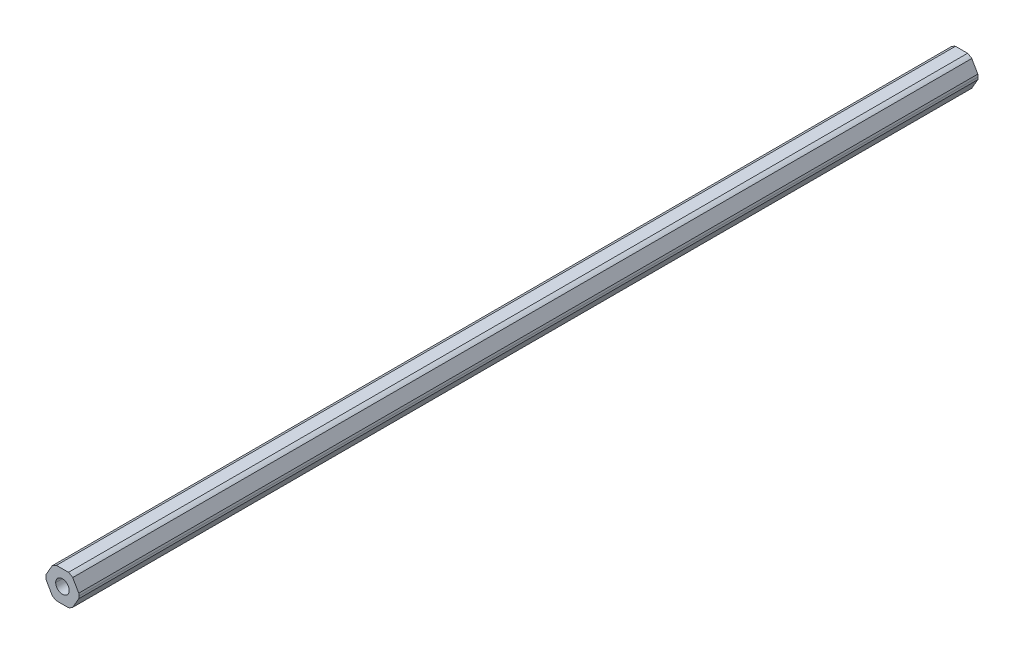
ISO-10303-21;
HEADER;
FILE_DESCRIPTION(('STEP AP214'),'2;1');
FILE_NAME('part.step','',(''),(''),'','','');
FILE_SCHEMA(('AUTOMOTIVE_DESIGN { 1 0 10303 214 1 1 1 1 }'));
ENDSEC;
DATA;
#1=APPLICATION_CONTEXT('core data for automotive mechanical design processes');
#2=APPLICATION_PROTOCOL_DEFINITION('international standard','automotive_design',2000,#1);
#3=PRODUCT_CONTEXT('',#1,'mechanical');
#4=PRODUCT('Part','Part','',(#3));
#5=PRODUCT_RELATED_PRODUCT_CATEGORY('part','',(#4));
#6=PRODUCT_DEFINITION_FORMATION('','',#4);
#7=PRODUCT_DEFINITION_CONTEXT('part definition',#1,'design');
#8=PRODUCT_DEFINITION('design','',#6,#7);
#9=PRODUCT_DEFINITION_SHAPE('','',#8);
#10=(LENGTH_UNIT() NAMED_UNIT(*) SI_UNIT(.MILLI.,.METRE.));
#11=(NAMED_UNIT(*) PLANE_ANGLE_UNIT() SI_UNIT($,.RADIAN.));
#12=(NAMED_UNIT(*) SI_UNIT($,.STERADIAN.) SOLID_ANGLE_UNIT());
#13=UNCERTAINTY_MEASURE_WITH_UNIT(LENGTH_MEASURE(1.E-05),#10,'distance_accuracy_value','');
#14=(GEOMETRIC_REPRESENTATION_CONTEXT(3) GLOBAL_UNCERTAINTY_ASSIGNED_CONTEXT((#13)) GLOBAL_UNIT_ASSIGNED_CONTEXT((#10,
#11,#12)) REPRESENTATION_CONTEXT('',''));
#15=CARTESIAN_POINT('',(0.,0.,0.));
#16=DIRECTION('',(0.,0.,1.));
#17=DIRECTION('',(1.,0.,0.));
#18=AXIS2_PLACEMENT_3D('',#15,#16,#17);
#19=CARTESIAN_POINT('',(-52.1346729987185,-22.9295542640871,-414.111242853386));
#20=DIRECTION('',(0.,0.,1.));
#21=DIRECTION('',(1.,0.,0.));
#22=AXIS2_PLACEMENT_3D('',#19,#20,#21);
#23=CYLINDRICAL_SURFACE('',#22,2.1);
#24=DIRECTION('',(0.,0.,1.));
#25=VECTOR('',#24,1.);
#26=CARTESIAN_POINT('',(-54.2346729987185,-22.9295542640871,-414.111242853386));
#27=LINE('',#26,#25);
#28=CARTESIAN_POINT('',(-54.2346729987185,-22.9295542640871,-414.111242853386));
#29=VERTEX_POINT('',#28);
#30=CARTESIAN_POINT('',(-54.2346729987185,-22.9295542640871,-134.711242853386));
#31=VERTEX_POINT('',#30);
#32=EDGE_CURVE('E52',#29,#31,#27,.T.);
#33=ORIENTED_EDGE('',*,*,#32,.T.);
#34=CARTESIAN_POINT('',(-52.1346729987185,-22.9295542640871,-134.711242853386));
#35=DIRECTION('',(0.,0.,-1.));
#36=DIRECTION('',(-1.,0.,0.));
#37=AXIS2_PLACEMENT_3D('',#34,#35,#36);
#38=CIRCLE('',#37,2.1);
#39=CARTESIAN_POINT('',(-50.0346729987185,-22.9295542640871,-134.711242853386));
#40=VERTEX_POINT('',#39);
#41=EDGE_CURVE('E66',#31,#40,#38,.F.);
#42=ORIENTED_EDGE('',*,*,#41,.T.);
#43=DIRECTION('',(0.,0.,1.));
#44=VECTOR('',#43,1.);
#45=CARTESIAN_POINT('',(-50.0346729987185,-22.9295542640871,-414.111242853386));
#46=LINE('',#45,#44);
#47=CARTESIAN_POINT('',(-50.0346729987185,-22.9295542640871,-414.111242853386));
#48=VERTEX_POINT('',#47);
#49=EDGE_CURVE('E168',#48,#40,#46,.T.);
#50=ORIENTED_EDGE('',*,*,#49,.F.);
#51=CARTESIAN_POINT('',(-52.1346729987185,-22.9295542640871,-414.111242853386));
#52=DIRECTION('',(0.,0.,1.));
#53=DIRECTION('',(1.,0.,0.));
#54=AXIS2_PLACEMENT_3D('',#51,#52,#53);
#55=CIRCLE('',#54,2.1);
#56=EDGE_CURVE('E209',#29,#48,#55,.T.);
#57=ORIENTED_EDGE('',*,*,#56,.F.);
#58=EDGE_LOOP('',(#33,#42,#50,#57));
#59=FACE_BOUND('',#58,.T.);
#60=ADVANCED_FACE('F44',(#59),#23,.F.);
#61=CARTESIAN_POINT('',(-52.1346729987185,-22.9295542640871,-414.111242853386));
#62=DIRECTION('',(0.,0.,1.));
#63=DIRECTION('',(1.,0.,0.));
#64=AXIS2_PLACEMENT_3D('',#61,#62,#63);
#65=CYLINDRICAL_SURFACE('',#64,5.12);
#66=CARTESIAN_POINT('',(-52.1346729987185,-22.9295542640871,-134.711242853386));
#67=DIRECTION('',(0.,0.,-1.));
#68=DIRECTION('',(-1.,0.,0.));
#69=AXIS2_PLACEMENT_3D('',#66,#67,#68);
#70=CIRCLE('',#69,5.12);
#71=CARTESIAN_POINT('',(-47.0704140331294,-23.6830004330005,-134.711242853386));
#72=VERTEX_POINT('',#71);
#73=CARTESIAN_POINT('',(-47.0146729987185,-22.9295542640871,-134.711242853386));
#74=VERTEX_POINT('',#73);
#75=EDGE_CURVE('E325',#72,#74,#70,.F.);
#76=ORIENTED_EDGE('',*,*,#75,.F.);
#77=DIRECTION('',(0.,0.,-1.));
#78=VECTOR('',#77,1.);
#79=CARTESIAN_POINT('',(-47.0704140331294,-23.6830004330005,-414.111242853386));
#80=LINE('',#79,#78);
#81=CARTESIAN_POINT('',(-47.0704140331294,-23.6830004330005,-414.111242853386));
#82=VERTEX_POINT('',#81);
#83=EDGE_CURVE('E244',#72,#82,#80,.T.);
#84=ORIENTED_EDGE('',*,*,#83,.T.);
#85=CARTESIAN_POINT('',(-52.1346729987185,-22.9295542640871,-414.111242853386));
#86=DIRECTION('',(0.,0.,1.));
#87=DIRECTION('',(1.,0.,0.));
#88=AXIS2_PLACEMENT_3D('',#85,#86,#87);
#89=CIRCLE('',#88,5.12);
#90=CARTESIAN_POINT('',(-47.0146729987185,-22.9295542640871,-414.111242853386));
#91=VERTEX_POINT('',#90);
#92=EDGE_CURVE('E195',#82,#91,#89,.T.);
#93=ORIENTED_EDGE('',*,*,#92,.T.);
#94=DIRECTION('',(0.,0.,1.));
#95=VECTOR('',#94,1.);
#96=CARTESIAN_POINT('',(-47.0146729987185,-22.9295542640871,-414.111242853386));
#97=LINE('',#96,#95);
#98=EDGE_CURVE('E246',#91,#74,#97,.T.);
#99=ORIENTED_EDGE('',*,*,#98,.T.);
#100=EDGE_LOOP('',(#76,#84,#93,#99));
#101=FACE_BOUND('',#100,.T.);
#102=ADVANCED_FACE('F372',(#101),#65,.T.);
#103=CARTESIAN_POINT('',(-49.3850423417029,-27.6920542640871,500.288757146614));
#104=DIRECTION('',(-0.866025403784442,0.5,0.));
#105=DIRECTION('',(0.,0.,1.));
#106=AXIS2_PLACEMENT_3D('',#103,#104,#105);
#107=PLANE('',#106);
#108=ORIENTED_EDGE('',*,*,#83,.F.);
#109=DIRECTION('',(-0.499999999999999,-0.866025403784439,0.));
#110=VECTOR('',#109,1.);
#111=CARTESIAN_POINT('',(-49.3850423417029,-27.6920542640871,-134.711242853386));
#112=LINE('',#111,#110);
#113=CARTESIAN_POINT('',(-48.9500399932608,-26.9386080951736,-134.711242853386));
#114=VERTEX_POINT('',#113);
#115=EDGE_CURVE('E297',#72,#114,#112,.T.);
#116=ORIENTED_EDGE('',*,*,#115,.T.);
#117=DIRECTION('',(0.,0.,1.));
#118=VECTOR('',#117,1.);
#119=CARTESIAN_POINT('',(-48.9500399932609,-26.9386080951736,-414.111242853386));
#120=LINE('',#119,#118);
#121=CARTESIAN_POINT('',(-48.9500399932609,-26.9386080951736,-414.111242853386));
#122=VERTEX_POINT('',#121);
#123=EDGE_CURVE('E212',#122,#114,#120,.T.);
#124=ORIENTED_EDGE('',*,*,#123,.F.);
#125=DIRECTION('',(0.5,0.866025403784442,0.));
#126=VECTOR('',#125,1.);
#127=CARTESIAN_POINT('',(-49.3850423417029,-27.6920542640871,-414.111242853386));
#128=LINE('',#127,#126);
#129=EDGE_CURVE('E241',#122,#82,#128,.T.);
#130=ORIENTED_EDGE('',*,*,#129,.T.);
#131=EDGE_LOOP('',(#108,#116,#124,#130));
#132=FACE_BOUND('',#131,.T.);
#133=ADVANCED_FACE('F46',(#132),#107,.F.);
#134=CARTESIAN_POINT('',(-46.6354116846874,-22.9295542640871,500.288757146614));
#135=DIRECTION('',(-0.866025403784438,-0.5,0.));
#136=DIRECTION('',(-0.5,0.866025403784438,0.));
#137=AXIS2_PLACEMENT_3D('',#134,#135,#136);
#138=PLANE('',#137);
#139=DIRECTION('',(0.,0.,-1.));
#140=VECTOR('',#139,1.);
#141=CARTESIAN_POINT('',(-48.9500399932609,-18.9205004330005,-414.111242853386));
#142=LINE('',#141,#140);
#143=CARTESIAN_POINT('',(-48.9500399932609,-18.9205004330005,-134.711242853386));
#144=VERTEX_POINT('',#143);
#145=CARTESIAN_POINT('',(-48.9500399932609,-18.9205004330005,-414.111242853386));
#146=VERTEX_POINT('',#145);
#147=EDGE_CURVE('E205',#144,#146,#142,.T.);
#148=ORIENTED_EDGE('',*,*,#147,.F.);
#149=DIRECTION('',(0.5,-0.866025403784438,0.));
#150=VECTOR('',#149,1.);
#151=CARTESIAN_POINT('',(-46.6354116846874,-22.9295542640871,-134.711242853386));
#152=LINE('',#151,#150);
#153=CARTESIAN_POINT('',(-47.0704140331294,-22.1761080951736,-134.711242853386));
#154=VERTEX_POINT('',#153);
#155=EDGE_CURVE('E59',#144,#154,#152,.T.);
#156=ORIENTED_EDGE('',*,*,#155,.T.);
#157=DIRECTION('',(0.,0.,1.));
#158=VECTOR('',#157,1.);
#159=CARTESIAN_POINT('',(-47.0704140331294,-22.1761080951736,-414.111242853386));
#160=LINE('',#159,#158);
#161=CARTESIAN_POINT('',(-47.0704140331294,-22.1761080951736,-414.111242853386));
#162=VERTEX_POINT('',#161);
#163=EDGE_CURVE('E216',#162,#154,#160,.T.);
#164=ORIENTED_EDGE('',*,*,#163,.F.);
#165=DIRECTION('',(-0.5,0.866025403784438,0.));
#166=VECTOR('',#165,1.);
#167=CARTESIAN_POINT('',(-46.6354116846874,-22.9295542640871,-414.111242853386));
#168=LINE('',#167,#166);
#169=EDGE_CURVE('E237',#162,#146,#168,.T.);
#170=ORIENTED_EDGE('',*,*,#169,.T.);
#171=EDGE_LOOP('',(#148,#156,#164,#170));
#172=FACE_BOUND('',#171,.T.);
#173=ADVANCED_FACE('F367',(#172),#138,.F.);
#174=CARTESIAN_POINT('',(-49.385042341703,-18.1670542640871,500.288757146614));
#175=DIRECTION('',(0.,-1.,0.));
#176=DIRECTION('',(0.,0.,-1.));
#177=AXIS2_PLACEMENT_3D('',#174,#175,#176);
#178=PLANE('',#177);
#179=DIRECTION('',(0.,0.,-1.));
#180=VECTOR('',#179,1.);
#181=CARTESIAN_POINT('',(-54.01429895885,-18.1670542640871,-414.111242853386));
#182=LINE('',#181,#180);
#183=CARTESIAN_POINT('',(-54.01429895885,-18.1670542640871,-134.711242853386));
#184=VERTEX_POINT('',#183);
#185=CARTESIAN_POINT('',(-54.01429895885,-18.1670542640871,-414.111242853386));
#186=VERTEX_POINT('',#185);
#187=EDGE_CURVE('E224',#184,#186,#182,.T.);
#188=ORIENTED_EDGE('',*,*,#187,.F.);
#189=DIRECTION('',(1.,0.,0.));
#190=VECTOR('',#189,1.);
#191=CARTESIAN_POINT('',(-49.385042341703,-18.1670542640871,-134.711242853386));
#192=LINE('',#191,#190);
#193=CARTESIAN_POINT('',(-50.2550470385871,-18.1670542640871,-134.711242853386));
#194=VERTEX_POINT('',#193);
#195=EDGE_CURVE('E335',#184,#194,#192,.T.);
#196=ORIENTED_EDGE('',*,*,#195,.T.);
#197=DIRECTION('',(0.,0.,1.));
#198=VECTOR('',#197,1.);
#199=CARTESIAN_POINT('',(-50.2550470385871,-18.1670542640871,-414.111242853386));
#200=LINE('',#199,#198);
#201=CARTESIAN_POINT('',(-50.2550470385871,-18.1670542640871,-414.111242853386));
#202=VERTEX_POINT('',#201);
#203=EDGE_CURVE('E177',#202,#194,#200,.T.);
#204=ORIENTED_EDGE('',*,*,#203,.F.);
#205=DIRECTION('',(-1.,0.,0.));
#206=VECTOR('',#205,1.);
#207=CARTESIAN_POINT('',(-49.385042341703,-18.1670542640871,-414.111242853386));
#208=LINE('',#207,#206);
#209=EDGE_CURVE('E192',#202,#186,#208,.T.);
#210=ORIENTED_EDGE('',*,*,#209,.T.);
#211=EDGE_LOOP('',(#188,#196,#204,#210));
#212=FACE_BOUND('',#211,.T.);
#213=ADVANCED_FACE('F343',(#212),#178,.F.);
#214=CARTESIAN_POINT('',(-54.8843036557342,-18.1670542640871,500.288757146614));
#215=DIRECTION('',(0.866025403784442,-0.5,0.));
#216=DIRECTION('',(0.,0.,-1.));
#217=AXIS2_PLACEMENT_3D('',#214,#215,#216);
#218=PLANE('',#217);
#219=DIRECTION('',(0.,0.,-1.));
#220=VECTOR('',#219,1.);
#221=CARTESIAN_POINT('',(-57.1989319643077,-22.1761080951737,-414.111242853386));
#222=LINE('',#221,#220);
#223=CARTESIAN_POINT('',(-57.1989319643077,-22.1761080951737,-134.711242853386));
#224=VERTEX_POINT('',#223);
#225=CARTESIAN_POINT('',(-57.1989319643077,-22.1761080951737,-414.111242853386));
#226=VERTEX_POINT('',#225);
#227=EDGE_CURVE('E201',#224,#226,#222,.T.);
#228=ORIENTED_EDGE('',*,*,#227,.F.);
#229=DIRECTION('',(0.499999999999999,0.866025403784439,0.));
#230=VECTOR('',#229,1.);
#231=CARTESIAN_POINT('',(-54.8843036557342,-18.1670542640871,-134.711242853386));
#232=LINE('',#231,#230);
#233=CARTESIAN_POINT('',(-55.3193060041762,-18.9205004330005,-134.711242853386));
#234=VERTEX_POINT('',#233);
#235=EDGE_CURVE('E327',#224,#234,#232,.T.);
#236=ORIENTED_EDGE('',*,*,#235,.T.);
#237=DIRECTION('',(0.,0.,1.));
#238=VECTOR('',#237,1.);
#239=CARTESIAN_POINT('',(-55.3193060041762,-18.9205004330005,-414.111242853386));
#240=LINE('',#239,#238);
#241=CARTESIAN_POINT('',(-55.3193060041762,-18.9205004330005,-414.111242853386));
#242=VERTEX_POINT('',#241);
#243=EDGE_CURVE('E243',#242,#234,#240,.T.);
#244=ORIENTED_EDGE('',*,*,#243,.F.);
#245=DIRECTION('',(-0.5,-0.866025403784442,0.));
#246=VECTOR('',#245,1.);
#247=CARTESIAN_POINT('',(-54.8843036557342,-18.1670542640871,-414.111242853386));
#248=LINE('',#247,#246);
#249=EDGE_CURVE('E228',#242,#226,#248,.T.);
#250=ORIENTED_EDGE('',*,*,#249,.T.);
#251=EDGE_LOOP('',(#228,#236,#244,#250));
#252=FACE_BOUND('',#251,.T.);
#253=ADVANCED_FACE('F359',(#252),#218,.F.);
#254=CARTESIAN_POINT('',(-57.6339343127497,-22.9295542640871,500.288757146614));
#255=DIRECTION('',(0.866025403784435,0.500000000000007,0.));
#256=DIRECTION('',(0.,0.,-1.));
#257=AXIS2_PLACEMENT_3D('',#254,#255,#256);
#258=PLANE('',#257);
#259=DIRECTION('',(0.,0.,-1.));
#260=VECTOR('',#259,1.);
#261=CARTESIAN_POINT('',(-55.3193060041761,-26.9386080951737,-414.111242853386));
#262=LINE('',#261,#260);
#263=CARTESIAN_POINT('',(-55.3193060041761,-26.9386080951737,-134.711242853386));
#264=VERTEX_POINT('',#263);
#265=CARTESIAN_POINT('',(-55.3193060041761,-26.9386080951737,-414.111242853386));
#266=VERTEX_POINT('',#265);
#267=EDGE_CURVE('E236',#264,#266,#262,.T.);
#268=ORIENTED_EDGE('',*,*,#267,.F.);
#269=DIRECTION('',(-0.500000000000007,0.866025403784435,0.));
#270=VECTOR('',#269,1.);
#271=CARTESIAN_POINT('',(-57.6339343127497,-22.9295542640871,-134.711242853386));
#272=LINE('',#271,#270);
#273=CARTESIAN_POINT('',(-57.1989319643076,-23.6830004330005,-134.711242853386));
#274=VERTEX_POINT('',#273);
#275=EDGE_CURVE('E296',#264,#274,#272,.T.);
#276=ORIENTED_EDGE('',*,*,#275,.T.);
#277=DIRECTION('',(0.,0.,1.));
#278=VECTOR('',#277,1.);
#279=CARTESIAN_POINT('',(-57.1989319643077,-23.6830004330005,-414.111242853386));
#280=LINE('',#279,#278);
#281=CARTESIAN_POINT('',(-57.1989319643077,-23.6830004330005,-414.111242853386));
#282=VERTEX_POINT('',#281);
#283=EDGE_CURVE('E226',#282,#274,#280,.T.);
#284=ORIENTED_EDGE('',*,*,#283,.F.);
#285=DIRECTION('',(0.500000000000007,-0.866025403784435,0.));
#286=VECTOR('',#285,1.);
#287=CARTESIAN_POINT('',(-57.6339343127497,-22.9295542640871,-414.111242853386));
#288=LINE('',#287,#286);
#289=EDGE_CURVE('E232',#282,#266,#288,.T.);
#290=ORIENTED_EDGE('',*,*,#289,.T.);
#291=EDGE_LOOP('',(#268,#276,#284,#290));
#292=FACE_BOUND('',#291,.T.);
#293=ADVANCED_FACE('F295',(#292),#258,.F.);
#294=CARTESIAN_POINT('',(-54.8843036557341,-27.6920542640871,500.288757146614));
#295=DIRECTION('',(0.,1.,0.));
#296=DIRECTION('',(1.,0.,0.));
#297=AXIS2_PLACEMENT_3D('',#294,#295,#296);
#298=PLANE('',#297);
#299=DIRECTION('',(0.,0.,-1.));
#300=VECTOR('',#299,1.);
#301=CARTESIAN_POINT('',(-50.255047038587,-27.6920542640871,-414.111242853386));
#302=LINE('',#301,#300);
#303=CARTESIAN_POINT('',(-50.255047038587,-27.692054264087,-134.711242853386));
#304=VERTEX_POINT('',#303);
#305=CARTESIAN_POINT('',(-50.255047038587,-27.6920542640871,-414.111242853386));
#306=VERTEX_POINT('',#305);
#307=EDGE_CURVE('E217',#304,#306,#302,.T.);
#308=ORIENTED_EDGE('',*,*,#307,.F.);
#309=DIRECTION('',(-1.,0.,0.));
#310=VECTOR('',#309,1.);
#311=CARTESIAN_POINT('',(-54.8843036557341,-27.6920542640871,-134.711242853386));
#312=LINE('',#311,#310);
#313=CARTESIAN_POINT('',(-54.01429895885,-27.6920542640871,-134.711242853386));
#314=VERTEX_POINT('',#313);
#315=EDGE_CURVE('E178',#304,#314,#312,.T.);
#316=ORIENTED_EDGE('',*,*,#315,.T.);
#317=DIRECTION('',(0.,0.,1.));
#318=VECTOR('',#317,1.);
#319=CARTESIAN_POINT('',(-54.01429895885,-27.6920542640871,-414.111242853386));
#320=LINE('',#319,#318);
#321=CARTESIAN_POINT('',(-54.01429895885,-27.6920542640871,-414.111242853386));
#322=VERTEX_POINT('',#321);
#323=EDGE_CURVE('E196',#322,#314,#320,.T.);
#324=ORIENTED_EDGE('',*,*,#323,.F.);
#325=DIRECTION('',(1.,0.,0.));
#326=VECTOR('',#325,1.);
#327=CARTESIAN_POINT('',(-54.8843036557341,-27.6920542640871,-414.111242853386));
#328=LINE('',#327,#326);
#329=EDGE_CURVE('E208',#322,#306,#328,.T.);
#330=ORIENTED_EDGE('',*,*,#329,.T.);
#331=EDGE_LOOP('',(#308,#316,#324,#330));
#332=FACE_BOUND('',#331,.T.);
#333=ADVANCED_FACE('F318',(#332),#298,.F.);
#334=CARTESIAN_POINT('',(-52.1346729987185,-22.9295542640871,-414.111242853386));
#335=DIRECTION('',(0.,0.,1.));
#336=DIRECTION('',(1.,0.,0.));
#337=AXIS2_PLACEMENT_3D('',#334,#335,#336);
#338=PLANE('',#337);
#339=CARTESIAN_POINT('',(-52.1346729987185,-22.9295542640871,-414.111242853386));
#340=DIRECTION('',(0.,0.,1.));
#341=DIRECTION('',(1.,0.,0.));
#342=AXIS2_PLACEMENT_3D('',#339,#340,#341);
#343=CIRCLE('',#342,5.12);
#344=EDGE_CURVE('E185',#146,#202,#343,.T.);
#345=ORIENTED_EDGE('',*,*,#344,.F.);
#346=ORIENTED_EDGE('',*,*,#169,.F.);
#347=CARTESIAN_POINT('',(-52.1346729987185,-22.9295542640871,-414.111242853386));
#348=DIRECTION('',(0.,0.,1.));
#349=DIRECTION('',(1.,0.,0.));
#350=AXIS2_PLACEMENT_3D('',#347,#348,#349);
#351=CIRCLE('',#350,5.12);
#352=EDGE_CURVE('E218',#91,#162,#351,.T.);
#353=ORIENTED_EDGE('',*,*,#352,.F.);
#354=ORIENTED_EDGE('',*,*,#92,.F.);
#355=ORIENTED_EDGE('',*,*,#129,.F.);
#356=CARTESIAN_POINT('',(-52.1346729987185,-22.9295542640871,-414.111242853386));
#357=DIRECTION('',(0.,0.,1.));
#358=DIRECTION('',(1.,0.,0.));
#359=AXIS2_PLACEMENT_3D('',#356,#357,#358);
#360=CIRCLE('',#359,5.12);
#361=EDGE_CURVE('E223',#306,#122,#360,.T.);
#362=ORIENTED_EDGE('',*,*,#361,.F.);
#363=ORIENTED_EDGE('',*,*,#329,.F.);
#364=CARTESIAN_POINT('',(-52.1346729987185,-22.9295542640871,-414.111242853386));
#365=DIRECTION('',(0.,0.,1.));
#366=DIRECTION('',(1.,0.,0.));
#367=AXIS2_PLACEMENT_3D('',#364,#365,#366);
#368=CIRCLE('',#367,5.12);
#369=EDGE_CURVE('E200',#266,#322,#368,.T.);
#370=ORIENTED_EDGE('',*,*,#369,.F.);
#371=ORIENTED_EDGE('',*,*,#289,.F.);
#372=CARTESIAN_POINT('',(-52.1346729987185,-22.9295542640871,-414.111242853386));
#373=DIRECTION('',(0.,0.,1.));
#374=DIRECTION('',(1.,0.,0.));
#375=AXIS2_PLACEMENT_3D('',#372,#373,#374);
#376=CIRCLE('',#375,5.12);
#377=EDGE_CURVE('E211',#226,#282,#376,.T.);
#378=ORIENTED_EDGE('',*,*,#377,.F.);
#379=ORIENTED_EDGE('',*,*,#249,.F.);
#380=CARTESIAN_POINT('',(-52.1346729987185,-22.9295542640871,-414.111242853386));
#381=DIRECTION('',(0.,0.,1.));
#382=DIRECTION('',(1.,0.,0.));
#383=AXIS2_PLACEMENT_3D('',#380,#381,#382);
#384=CIRCLE('',#383,5.12);
#385=EDGE_CURVE('E227',#186,#242,#384,.T.);
#386=ORIENTED_EDGE('',*,*,#385,.F.);
#387=ORIENTED_EDGE('',*,*,#209,.F.);
#388=EDGE_LOOP('',(#345,#346,#353,#354,#355,#362,#363,#370,#371,#378,#379,#386,#387));
#389=FACE_BOUND('',#388,.T.);
#390=CARTESIAN_POINT('',(-52.1346729987185,-22.9295542640871,-414.111242853386));
#391=DIRECTION('',(0.,0.,1.));
#392=DIRECTION('',(1.,0.,0.));
#393=AXIS2_PLACEMENT_3D('',#390,#391,#392);
#394=CIRCLE('',#393,2.1);
#395=EDGE_CURVE('E175',#48,#29,#394,.T.);
#396=ORIENTED_EDGE('',*,*,#395,.T.);
#397=ORIENTED_EDGE('',*,*,#56,.T.);
#398=EDGE_LOOP('',(#396,#397));
#399=FACE_BOUND('',#398,.T.);
#400=ADVANCED_FACE('F310',(#389,#399),#338,.F.);
#401=CARTESIAN_POINT('',(-52.1346729987185,-22.9295542640871,-414.111242853386));
#402=DIRECTION('',(0.,0.,1.));
#403=DIRECTION('',(1.,0.,0.));
#404=AXIS2_PLACEMENT_3D('',#401,#402,#403);
#405=CYLINDRICAL_SURFACE('',#404,5.12);
#406=CARTESIAN_POINT('',(-52.1346729987185,-22.9295542640871,-134.711242853386));
#407=DIRECTION('',(0.,0.,-1.));
#408=DIRECTION('',(-1.,0.,0.));
#409=AXIS2_PLACEMENT_3D('',#406,#407,#408);
#410=CIRCLE('',#409,5.12);
#411=EDGE_CURVE('E330',#74,#154,#410,.F.);
#412=ORIENTED_EDGE('',*,*,#411,.F.);
#413=ORIENTED_EDGE('',*,*,#98,.F.);
#414=ORIENTED_EDGE('',*,*,#352,.T.);
#415=ORIENTED_EDGE('',*,*,#163,.T.);
#416=EDGE_LOOP('',(#412,#413,#414,#415));
#417=FACE_BOUND('',#416,.T.);
#418=ADVANCED_FACE('F392',(#417),#405,.T.);
#419=CARTESIAN_POINT('',(-52.1346729987185,-22.9295542640871,-414.111242853386));
#420=DIRECTION('',(0.,0.,1.));
#421=DIRECTION('',(1.,0.,0.));
#422=AXIS2_PLACEMENT_3D('',#419,#420,#421);
#423=CYLINDRICAL_SURFACE('',#422,5.12);
#424=CARTESIAN_POINT('',(-52.1346729987185,-22.9295542640871,-134.711242853386));
#425=DIRECTION('',(0.,0.,-1.));
#426=DIRECTION('',(-1.,0.,0.));
#427=AXIS2_PLACEMENT_3D('',#424,#425,#426);
#428=CIRCLE('',#427,5.12);
#429=EDGE_CURVE('E188',#304,#114,#428,.F.);
#430=ORIENTED_EDGE('',*,*,#429,.F.);
#431=ORIENTED_EDGE('',*,*,#307,.T.);
#432=ORIENTED_EDGE('',*,*,#361,.T.);
#433=ORIENTED_EDGE('',*,*,#123,.T.);
#434=EDGE_LOOP('',(#430,#431,#432,#433));
#435=FACE_BOUND('',#434,.T.);
#436=ADVANCED_FACE('F317',(#435),#423,.T.);
#437=CARTESIAN_POINT('',(-52.1346729987185,-22.9295542640871,-414.111242853386));
#438=DIRECTION('',(0.,0.,1.));
#439=DIRECTION('',(1.,0.,0.));
#440=AXIS2_PLACEMENT_3D('',#437,#438,#439);
#441=CYLINDRICAL_SURFACE('',#440,5.12);
#442=CARTESIAN_POINT('',(-52.1346729987185,-22.9295542640871,-134.711242853386));
#443=DIRECTION('',(0.,0.,-1.));
#444=DIRECTION('',(-1.,0.,0.));
#445=AXIS2_PLACEMENT_3D('',#442,#443,#444);
#446=CIRCLE('',#445,5.12);
#447=EDGE_CURVE('E293',#264,#314,#446,.F.);
#448=ORIENTED_EDGE('',*,*,#447,.F.);
#449=ORIENTED_EDGE('',*,*,#267,.T.);
#450=ORIENTED_EDGE('',*,*,#369,.T.);
#451=ORIENTED_EDGE('',*,*,#323,.T.);
#452=EDGE_LOOP('',(#448,#449,#450,#451));
#453=FACE_BOUND('',#452,.T.);
#454=ADVANCED_FACE('F292',(#453),#441,.T.);
#455=CARTESIAN_POINT('',(-52.1346729987185,-22.9295542640871,-414.111242853386));
#456=DIRECTION('',(0.,0.,1.));
#457=DIRECTION('',(1.,0.,0.));
#458=AXIS2_PLACEMENT_3D('',#455,#456,#457);
#459=CYLINDRICAL_SURFACE('',#458,5.12);
#460=ORIENTED_EDGE('',*,*,#283,.T.);
#461=CARTESIAN_POINT('',(-52.1346729987185,-22.9295542640871,-134.711242853386));
#462=DIRECTION('',(0.,0.,-1.));
#463=DIRECTION('',(-1.,0.,0.));
#464=AXIS2_PLACEMENT_3D('',#461,#462,#463);
#465=CIRCLE('',#464,5.12);
#466=EDGE_CURVE('E298',#224,#274,#465,.F.);
#467=ORIENTED_EDGE('',*,*,#466,.F.);
#468=ORIENTED_EDGE('',*,*,#227,.T.);
#469=ORIENTED_EDGE('',*,*,#377,.T.);
#470=EDGE_LOOP('',(#460,#467,#468,#469));
#471=FACE_BOUND('',#470,.T.);
#472=ADVANCED_FACE('F303',(#471),#459,.T.);
#473=CARTESIAN_POINT('',(-52.1346729987185,-22.9295542640871,-414.111242853386));
#474=DIRECTION('',(0.,0.,1.));
#475=DIRECTION('',(1.,0.,0.));
#476=AXIS2_PLACEMENT_3D('',#473,#474,#475);
#477=CYLINDRICAL_SURFACE('',#476,5.12);
#478=CARTESIAN_POINT('',(-52.1346729987185,-22.9295542640871,-134.711242853386));
#479=DIRECTION('',(0.,0.,-1.));
#480=DIRECTION('',(-1.,0.,0.));
#481=AXIS2_PLACEMENT_3D('',#478,#479,#480);
#482=CIRCLE('',#481,5.12);
#483=EDGE_CURVE('E332',#184,#234,#482,.F.);
#484=ORIENTED_EDGE('',*,*,#483,.F.);
#485=ORIENTED_EDGE('',*,*,#187,.T.);
#486=ORIENTED_EDGE('',*,*,#385,.T.);
#487=ORIENTED_EDGE('',*,*,#243,.T.);
#488=EDGE_LOOP('',(#484,#485,#486,#487));
#489=FACE_BOUND('',#488,.T.);
#490=ADVANCED_FACE('F357',(#489),#477,.T.);
#491=CARTESIAN_POINT('',(-52.1346729987185,-22.9295542640871,-414.111242853386));
#492=DIRECTION('',(0.,0.,1.));
#493=DIRECTION('',(1.,0.,0.));
#494=AXIS2_PLACEMENT_3D('',#491,#492,#493);
#495=CYLINDRICAL_SURFACE('',#494,5.12);
#496=CARTESIAN_POINT('',(-52.1346729987185,-22.9295542640871,-134.711242853386));
#497=DIRECTION('',(0.,0.,-1.));
#498=DIRECTION('',(-1.,0.,0.));
#499=AXIS2_PLACEMENT_3D('',#496,#497,#498);
#500=CIRCLE('',#499,5.12);
#501=EDGE_CURVE('E170',#144,#194,#500,.F.);
#502=ORIENTED_EDGE('',*,*,#501,.F.);
#503=ORIENTED_EDGE('',*,*,#147,.T.);
#504=ORIENTED_EDGE('',*,*,#344,.T.);
#505=ORIENTED_EDGE('',*,*,#203,.T.);
#506=EDGE_LOOP('',(#502,#503,#504,#505));
#507=FACE_BOUND('',#506,.T.);
#508=ADVANCED_FACE('F346',(#507),#495,.T.);
#509=CARTESIAN_POINT('',(-52.1346729987185,-22.9295542640871,-414.111242853386));
#510=DIRECTION('',(0.,0.,1.));
#511=DIRECTION('',(1.,0.,0.));
#512=AXIS2_PLACEMENT_3D('',#509,#510,#511);
#513=CYLINDRICAL_SURFACE('',#512,2.1);
#514=ORIENTED_EDGE('',*,*,#49,.T.);
#515=CARTESIAN_POINT('',(-52.1346729987185,-22.9295542640871,-134.711242853386));
#516=DIRECTION('',(0.,0.,-1.));
#517=DIRECTION('',(-1.,0.,0.));
#518=AXIS2_PLACEMENT_3D('',#515,#516,#517);
#519=CIRCLE('',#518,2.1);
#520=EDGE_CURVE('E11',#40,#31,#519,.F.);
#521=ORIENTED_EDGE('',*,*,#520,.T.);
#522=ORIENTED_EDGE('',*,*,#32,.F.);
#523=ORIENTED_EDGE('',*,*,#395,.F.);
#524=EDGE_LOOP('',(#514,#521,#522,#523));
#525=FACE_BOUND('',#524,.T.);
#526=ADVANCED_FACE('F173',(#525),#513,.F.);
#527=CARTESIAN_POINT('',(-57.2546729987185,124.262124013139,-134.711242853386));
#528=DIRECTION('',(0.,0.,-1.));
#529=DIRECTION('',(-1.,0.,0.));
#530=AXIS2_PLACEMENT_3D('',#527,#528,#529);
#531=PLANE('',#530);
#532=ORIENTED_EDGE('',*,*,#520,.F.);
#533=ORIENTED_EDGE('',*,*,#41,.F.);
#534=EDGE_LOOP('',(#532,#533));
#535=FACE_BOUND('',#534,.T.);
#536=ORIENTED_EDGE('',*,*,#429,.T.);
#537=ORIENTED_EDGE('',*,*,#115,.F.);
#538=ORIENTED_EDGE('',*,*,#75,.T.);
#539=ORIENTED_EDGE('',*,*,#411,.T.);
#540=ORIENTED_EDGE('',*,*,#155,.F.);
#541=ORIENTED_EDGE('',*,*,#501,.T.);
#542=ORIENTED_EDGE('',*,*,#195,.F.);
#543=ORIENTED_EDGE('',*,*,#483,.T.);
#544=ORIENTED_EDGE('',*,*,#235,.F.);
#545=ORIENTED_EDGE('',*,*,#466,.T.);
#546=ORIENTED_EDGE('',*,*,#275,.F.);
#547=ORIENTED_EDGE('',*,*,#447,.T.);
#548=ORIENTED_EDGE('',*,*,#315,.F.);
#549=EDGE_LOOP('',(#536,#537,#538,#539,#540,#541,#542,#543,#544,#545,#546,#547,#548));
#550=FACE_BOUND('',#549,.T.);
#551=ADVANCED_FACE('F162',(#535,#550),#531,.F.);
#552=CLOSED_SHELL('',(#60,#102,#133,#173,#213,#253,#293,#333,#400,#418,#436,#454,#472,#490,#508,
#526,#551));
#553=MANIFOLD_SOLID_BREP('B2',#552);
#554=ADVANCED_BREP_SHAPE_REPRESENTATION('',(#18,#553),#14);
#555=SHAPE_DEFINITION_REPRESENTATION(#9,#554);
ENDSEC;
END-ISO-10303-21;
